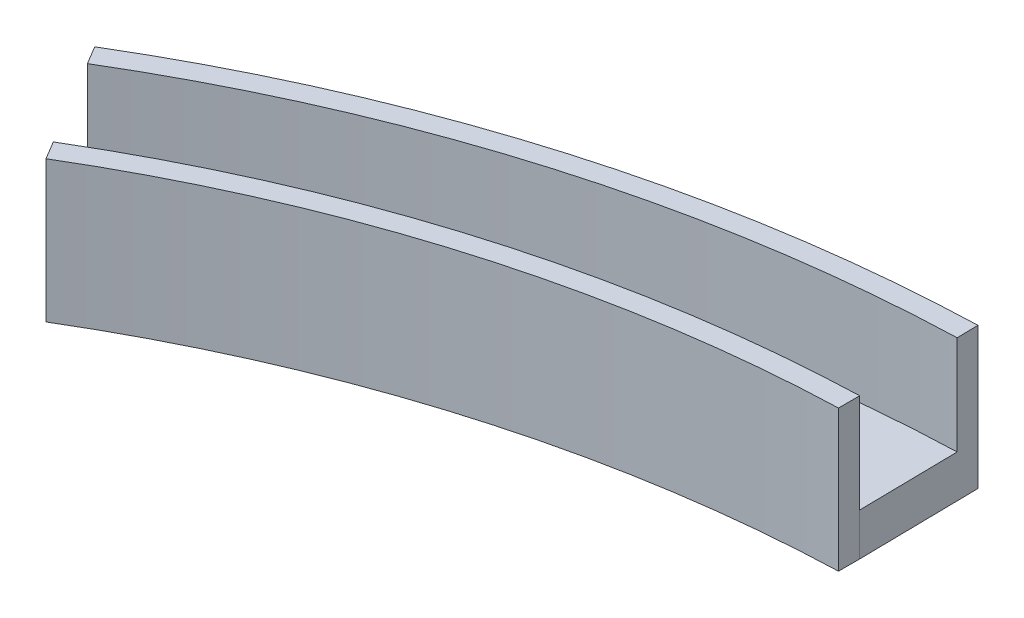
ISO-10303-21;
HEADER;
FILE_DESCRIPTION(('STEP AP214'),'2;1');
FILE_NAME('part.step','',(''),(''),'','','');
FILE_SCHEMA(('AUTOMOTIVE_DESIGN { 1 0 10303 214 1 1 1 1 }'));
ENDSEC;
DATA;
#1=APPLICATION_CONTEXT('core data for automotive mechanical design processes');
#2=APPLICATION_PROTOCOL_DEFINITION('international standard','automotive_design',2000,#1);
#3=PRODUCT_CONTEXT('',#1,'mechanical');
#4=PRODUCT('Part','Part','',(#3));
#5=PRODUCT_RELATED_PRODUCT_CATEGORY('part','',(#4));
#6=PRODUCT_DEFINITION_FORMATION('','',#4);
#7=PRODUCT_DEFINITION_CONTEXT('part definition',#1,'design');
#8=PRODUCT_DEFINITION('design','',#6,#7);
#9=PRODUCT_DEFINITION_SHAPE('','',#8);
#10=(LENGTH_UNIT() NAMED_UNIT(*) SI_UNIT(.MILLI.,.METRE.));
#11=(NAMED_UNIT(*) PLANE_ANGLE_UNIT() SI_UNIT($,.RADIAN.));
#12=(NAMED_UNIT(*) SI_UNIT($,.STERADIAN.) SOLID_ANGLE_UNIT());
#13=UNCERTAINTY_MEASURE_WITH_UNIT(LENGTH_MEASURE(1.E-05),#10,'distance_accuracy_value','');
#14=(GEOMETRIC_REPRESENTATION_CONTEXT(3) GLOBAL_UNCERTAINTY_ASSIGNED_CONTEXT((#13)) GLOBAL_UNIT_ASSIGNED_CONTEXT((#10,
#11,#12)) REPRESENTATION_CONTEXT('',''));
#15=CARTESIAN_POINT('',(0.,0.,0.));
#16=DIRECTION('',(0.,0.,1.));
#17=DIRECTION('',(1.,0.,0.));
#18=AXIS2_PLACEMENT_3D('',#15,#16,#17);
#19=CARTESIAN_POINT('',(0.,10.,0.));
#20=DIRECTION('',(0.,-1.,0.));
#21=DIRECTION('',(0.,0.,-1.));
#22=AXIS2_PLACEMENT_3D('',#19,#20,#21);
#23=PLANE('',#22);
#24=DIRECTION('',(0.,0.,-1.));
#25=VECTOR('',#24,1.);
#26=CARTESIAN_POINT('',(-3.06425353736783,10.,-91.753846651019));
#27=LINE('',#26,#25);
#28=CARTESIAN_POINT('',(-3.06425353736788,10.,-90.2529964890846));
#29=VERTEX_POINT('',#28);
#30=CARTESIAN_POINT('',(-3.06425353736783,10.,-91.7538466510191));
#31=VERTEX_POINT('',#30);
#32=EDGE_CURVE('E175',#29,#31,#27,.T.);
#33=ORIENTED_EDGE('',*,*,#32,.T.);
#34=CARTESIAN_POINT('',(0.,10.,0.));
#35=DIRECTION('',(0.,-1.,0.));
#36=DIRECTION('',(0.,0.,-1.));
#37=AXIS2_PLACEMENT_3D('',#34,#35,#36);
#38=CIRCLE('',#37,91.805);
#39=CARTESIAN_POINT('',(-47.1395277057146,10.,-78.7783152439944));
#40=VERTEX_POINT('',#39);
#41=EDGE_CURVE('E115',#40,#31,#38,.T.);
#42=ORIENTED_EDGE('',*,*,#41,.F.);
#43=DIRECTION('',(0.513474513432979,0.,0.858104844441963));
#44=VECTOR('',#43,1.);
#45=CARTESIAN_POINT('',(-51.5040610698953,10.,-86.0722064217518));
#46=LINE('',#45,#44);
#47=CARTESIAN_POINT('',(-46.3693159355651,10.,-77.4911579773315));
#48=VERTEX_POINT('',#47);
#49=EDGE_CURVE('E166',#40,#48,#46,.T.);
#50=ORIENTED_EDGE('',*,*,#49,.T.);
#51=CARTESIAN_POINT('',(0.,10.,0.));
#52=DIRECTION('',(0.,-1.,0.));
#53=DIRECTION('',(0.,0.,-1.));
#54=AXIS2_PLACEMENT_3D('',#51,#52,#53);
#55=CIRCLE('',#54,90.305);
#56=EDGE_CURVE('E154',#48,#29,#55,.T.);
#57=ORIENTED_EDGE('',*,*,#56,.T.);
#58=EDGE_LOOP('',(#33,#42,#50,#57));
#59=FACE_BOUND('',#58,.T.);
#60=ADVANCED_FACE('F33',(#59),#23,.F.);
#61=CARTESIAN_POINT('',(0.,10.,0.));
#62=DIRECTION('',(0.,-1.,0.));
#63=DIRECTION('',(0.,0.,-1.));
#64=AXIS2_PLACEMENT_3D('',#61,#62,#63);
#65=CYLINDRICAL_SURFACE('',#64,100.305000000001);
#66=CARTESIAN_POINT('',(0.,0.,0.));
#67=DIRECTION('',(0.,1.,0.));
#68=DIRECTION('',(0.,0.,-1.));
#69=AXIS2_PLACEMENT_3D('',#66,#67,#68);
#70=CIRCLE('',#69,100.305000000001);
#71=CARTESIAN_POINT('',(-3.19712388274214,0.,-100.254034451879));
#72=VERTEX_POINT('',#71);
#73=CARTESIAN_POINT('',(-51.5040610698953,0.,-86.0722064217518));
#74=VERTEX_POINT('',#73);
#75=EDGE_CURVE('E162',#72,#74,#70,.T.);
#76=ORIENTED_EDGE('',*,*,#75,.T.);
#77=DIRECTION('',(0.,-1.,0.));
#78=VECTOR('',#77,1.);
#79=CARTESIAN_POINT('',(-51.5040610698953,10.,-86.0722064217518));
#80=LINE('',#79,#78);
#81=CARTESIAN_POINT('',(-51.5040610698953,10.,-86.0722064217518));
#82=VERTEX_POINT('',#81);
#83=EDGE_CURVE('E11',#82,#74,#80,.T.);
#84=ORIENTED_EDGE('',*,*,#83,.F.);
#85=CARTESIAN_POINT('',(0.,10.,0.));
#86=DIRECTION('',(0.,1.,0.));
#87=DIRECTION('',(0.,0.,-1.));
#88=AXIS2_PLACEMENT_3D('',#85,#86,#87);
#89=CIRCLE('',#88,100.305000000001);
#90=CARTESIAN_POINT('',(-3.19712388274214,10.,-100.254034451879));
#91=VERTEX_POINT('',#90);
#92=EDGE_CURVE('E165',#91,#82,#89,.T.);
#93=ORIENTED_EDGE('',*,*,#92,.F.);
#94=DIRECTION('',(0.,-1.,0.));
#95=VECTOR('',#94,1.);
#96=CARTESIAN_POINT('',(-3.19712388274214,10.,-100.254034451879));
#97=LINE('',#96,#95);
#98=EDGE_CURVE('E142',#91,#72,#97,.T.);
#99=ORIENTED_EDGE('',*,*,#98,.T.);
#100=EDGE_LOOP('',(#76,#84,#93,#99));
#101=FACE_BOUND('',#100,.T.);
#102=ADVANCED_FACE('F35',(#101),#65,.T.);
#103=CARTESIAN_POINT('',(-47.1395277057146,10.,-78.7783152439945));
#104=DIRECTION('',(0.858104844441963,0.,-0.513474513432979));
#105=DIRECTION('',(-0.513474513432979,0.,-0.858104844441963));
#106=AXIS2_PLACEMENT_3D('',#103,#104,#105);
#107=PLANE('',#106);
#108=ORIENTED_EDGE('',*,*,#49,.F.);
#109=DIRECTION('',(0.,1.,0.));
#110=VECTOR('',#109,1.);
#111=CARTESIAN_POINT('',(-47.1395277057146,3.,-78.7783152439944));
#112=LINE('',#111,#110);
#113=CARTESIAN_POINT('',(-47.1395277057146,3.,-78.7783152439944));
#114=VERTEX_POINT('',#113);
#115=EDGE_CURVE('E178',#114,#40,#112,.T.);
#116=ORIENTED_EDGE('',*,*,#115,.F.);
#117=DIRECTION('',(0.513474513432979,0.,0.858104844441963));
#118=VECTOR('',#117,1.);
#119=CARTESIAN_POINT('',(-50.7338492997454,3.,-84.7850491550882));
#120=LINE('',#119,#118);
#121=CARTESIAN_POINT('',(-50.7338492997454,3.,-84.7850491550882));
#122=VERTEX_POINT('',#121);
#123=EDGE_CURVE('E130',#122,#114,#120,.T.);
#124=ORIENTED_EDGE('',*,*,#123,.F.);
#125=DIRECTION('',(0.,1.,0.));
#126=VECTOR('',#125,1.);
#127=CARTESIAN_POINT('',(-50.7338492997454,3.,-84.7850491550882));
#128=LINE('',#127,#126);
#129=CARTESIAN_POINT('',(-50.7338492997454,10.,-84.7850491550882));
#130=VERTEX_POINT('',#129);
#131=EDGE_CURVE('E180',#122,#130,#128,.T.);
#132=ORIENTED_EDGE('',*,*,#131,.T.);
#133=EDGE_CURVE('E87',#82,#130,#46,.T.);
#134=ORIENTED_EDGE('',*,*,#133,.F.);
#135=ORIENTED_EDGE('',*,*,#83,.T.);
#136=DIRECTION('',(0.513474513432979,0.,0.858104844441963));
#137=VECTOR('',#136,1.);
#138=CARTESIAN_POINT('',(-47.1395277057146,0.,-78.7783152439945));
#139=LINE('',#138,#137);
#140=CARTESIAN_POINT('',(-46.3693159355651,0.,-77.4911579773315));
#141=VERTEX_POINT('',#140);
#142=EDGE_CURVE('E159',#74,#141,#139,.T.);
#143=ORIENTED_EDGE('',*,*,#142,.T.);
#144=DIRECTION('',(0.,-1.,0.));
#145=VECTOR('',#144,1.);
#146=CARTESIAN_POINT('',(-46.3693159355651,10.,-77.4911579773315));
#147=LINE('',#146,#145);
#148=EDGE_CURVE('E41',#48,#141,#147,.T.);
#149=ORIENTED_EDGE('',*,*,#148,.F.);
#150=EDGE_LOOP('',(#108,#116,#124,#132,#134,#135,#143,#149));
#151=FACE_BOUND('',#150,.T.);
#152=ADVANCED_FACE('F186',(#151),#107,.F.);
#153=CARTESIAN_POINT('',(0.,10.,0.));
#154=DIRECTION('',(0.,-1.,0.));
#155=DIRECTION('',(0.,0.,-1.));
#156=AXIS2_PLACEMENT_3D('',#153,#154,#155);
#157=CYLINDRICAL_SURFACE('',#156,90.305);
#158=CARTESIAN_POINT('',(0.,0.,0.));
#159=DIRECTION('',(0.,-1.,0.));
#160=DIRECTION('',(0.,0.,-1.));
#161=AXIS2_PLACEMENT_3D('',#158,#159,#160);
#162=CIRCLE('',#161,90.305);
#163=CARTESIAN_POINT('',(-3.06425353736788,0.,-90.2529964890846));
#164=VERTEX_POINT('',#163);
#165=EDGE_CURVE('E153',#141,#164,#162,.T.);
#166=ORIENTED_EDGE('',*,*,#165,.T.);
#167=DIRECTION('',(0.,-1.,0.));
#168=VECTOR('',#167,1.);
#169=CARTESIAN_POINT('',(-3.06425353736788,10.,-90.2529964890846));
#170=LINE('',#169,#168);
#171=EDGE_CURVE('E120',#29,#164,#170,.T.);
#172=ORIENTED_EDGE('',*,*,#171,.F.);
#173=ORIENTED_EDGE('',*,*,#56,.F.);
#174=ORIENTED_EDGE('',*,*,#148,.T.);
#175=EDGE_LOOP('',(#166,#172,#173,#174));
#176=FACE_BOUND('',#175,.T.);
#177=ADVANCED_FACE('F151',(#176),#157,.F.);
#178=CARTESIAN_POINT('',(-3.06425353736783,10.,-91.753846651019));
#179=DIRECTION('',(-1.,0.,0.));
#180=DIRECTION('',(0.,0.,1.));
#181=AXIS2_PLACEMENT_3D('',#178,#179,#180);
#182=PLANE('',#181);
#183=DIRECTION('',(0.,0.,-1.));
#184=VECTOR('',#183,1.);
#185=CARTESIAN_POINT('',(-3.06425353736783,0.,-91.753846651019));
#186=LINE('',#185,#184);
#187=CARTESIAN_POINT('',(-3.06425353736783,0.,-91.753846651019));
#188=VERTEX_POINT('',#187);
#189=EDGE_CURVE('E141',#164,#188,#186,.T.);
#190=ORIENTED_EDGE('',*,*,#189,.T.);
#191=DIRECTION('',(0.,-1.,0.));
#192=VECTOR('',#191,1.);
#193=CARTESIAN_POINT('',(-3.06425353736783,10.,-91.753846651019));
#194=LINE('',#193,#192);
#195=CARTESIAN_POINT('',(-3.06425353736783,3.,-91.7538466510191));
#196=VERTEX_POINT('',#195);
#197=EDGE_CURVE('E121',#196,#188,#194,.T.);
#198=ORIENTED_EDGE('',*,*,#197,.F.);
#199=EDGE_CURVE('E109',#31,#196,#194,.T.);
#200=ORIENTED_EDGE('',*,*,#199,.F.);
#201=ORIENTED_EDGE('',*,*,#32,.F.);
#202=ORIENTED_EDGE('',*,*,#171,.T.);
#203=EDGE_LOOP('',(#190,#198,#200,#201,#202));
#204=FACE_BOUND('',#203,.T.);
#205=ADVANCED_FACE('F138',(#204),#182,.F.);
#206=CARTESIAN_POINT('',(-3.19712388274214,10.,-100.254034451879));
#207=DIRECTION('',(-0.999877851113723,0.,0.0156295506078309));
#208=DIRECTION('',(0.0156295506078309,0.,0.999877851113723));
#209=AXIS2_PLACEMENT_3D('',#206,#207,#208);
#210=PLANE('',#209);
#211=DIRECTION('',(-0.0156295506078309,0.,-0.999877851113723));
#212=VECTOR('',#211,1.);
#213=CARTESIAN_POINT('',(-3.19712388274214,10.,-100.254034451879));
#214=LINE('',#213,#212);
#215=CARTESIAN_POINT('',(-3.17367641439483,10.,-98.7540166424471));
#216=VERTEX_POINT('',#215);
#217=EDGE_CURVE('E56',#216,#91,#214,.T.);
#218=ORIENTED_EDGE('',*,*,#217,.F.);
#219=DIRECTION('',(0.,1.,0.));
#220=VECTOR('',#219,1.);
#221=CARTESIAN_POINT('',(-3.17367641439486,3.,-98.7540166424471));
#222=LINE('',#221,#220);
#223=CARTESIAN_POINT('',(-3.17367641439486,3.,-98.7540166424471));
#224=VERTEX_POINT('',#223);
#225=EDGE_CURVE('E48',#224,#216,#222,.T.);
#226=ORIENTED_EDGE('',*,*,#225,.F.);
#227=DIRECTION('',(-0.0156295506078309,0.,-0.999877851113724));
#228=VECTOR('',#227,1.);
#229=CARTESIAN_POINT('',(-3.17367641439484,3.,-98.7540166424471));
#230=LINE('',#229,#228);
#231=EDGE_CURVE('E128',#196,#224,#230,.T.);
#232=ORIENTED_EDGE('',*,*,#231,.F.);
#233=ORIENTED_EDGE('',*,*,#197,.T.);
#234=DIRECTION('',(-0.0156295506078309,0.,-0.999877851113723));
#235=VECTOR('',#234,1.);
#236=CARTESIAN_POINT('',(-3.19712388274214,0.,-100.254034451879));
#237=LINE('',#236,#235);
#238=EDGE_CURVE('E80',#188,#72,#237,.T.);
#239=ORIENTED_EDGE('',*,*,#238,.T.);
#240=ORIENTED_EDGE('',*,*,#98,.F.);
#241=EDGE_LOOP('',(#218,#226,#232,#233,#239,#240));
#242=FACE_BOUND('',#241,.T.);
#243=ADVANCED_FACE('F134',(#242),#210,.F.);
#244=ORIENTED_EDGE('',*,*,#133,.T.);
#245=CARTESIAN_POINT('',(0.,10.,0.));
#246=DIRECTION('',(0.,1.,0.));
#247=DIRECTION('',(0.,0.,-1.));
#248=AXIS2_PLACEMENT_3D('',#245,#246,#247);
#249=CIRCLE('',#248,98.805);
#250=EDGE_CURVE('E132',#216,#130,#249,.T.);
#251=ORIENTED_EDGE('',*,*,#250,.F.);
#252=ORIENTED_EDGE('',*,*,#217,.T.);
#253=ORIENTED_EDGE('',*,*,#92,.T.);
#254=EDGE_LOOP('',(#244,#251,#252,#253));
#255=FACE_BOUND('',#254,.T.);
#256=ADVANCED_FACE('F190',(#255),#23,.F.);
#257=CARTESIAN_POINT('',(0.,0.,0.));
#258=DIRECTION('',(0.,-1.,0.));
#259=DIRECTION('',(0.,0.,-1.));
#260=AXIS2_PLACEMENT_3D('',#257,#258,#259);
#261=PLANE('',#260);
#262=ORIENTED_EDGE('',*,*,#75,.F.);
#263=ORIENTED_EDGE('',*,*,#238,.F.);
#264=ORIENTED_EDGE('',*,*,#189,.F.);
#265=ORIENTED_EDGE('',*,*,#165,.F.);
#266=ORIENTED_EDGE('',*,*,#142,.F.);
#267=EDGE_LOOP('',(#262,#263,#264,#265,#266));
#268=FACE_BOUND('',#267,.T.);
#269=ADVANCED_FACE('F158',(#268),#261,.T.);
#270=CARTESIAN_POINT('',(0.,3.,0.));
#271=DIRECTION('',(0.,1.,0.));
#272=DIRECTION('',(0.,0.,1.));
#273=AXIS2_PLACEMENT_3D('',#270,#271,#272);
#274=CYLINDRICAL_SURFACE('',#273,91.805);
#275=ORIENTED_EDGE('',*,*,#41,.T.);
#276=ORIENTED_EDGE('',*,*,#199,.T.);
#277=CARTESIAN_POINT('',(0.,3.,0.));
#278=DIRECTION('',(0.,-1.,0.));
#279=DIRECTION('',(0.,0.,-1.));
#280=AXIS2_PLACEMENT_3D('',#277,#278,#279);
#281=CIRCLE('',#280,91.805);
#282=EDGE_CURVE('E112',#114,#196,#281,.T.);
#283=ORIENTED_EDGE('',*,*,#282,.F.);
#284=ORIENTED_EDGE('',*,*,#115,.T.);
#285=EDGE_LOOP('',(#275,#276,#283,#284));
#286=FACE_BOUND('',#285,.T.);
#287=ADVANCED_FACE('F111',(#286),#274,.T.);
#288=CARTESIAN_POINT('',(0.,3.,0.));
#289=DIRECTION('',(0.,1.,0.));
#290=DIRECTION('',(0.,0.,1.));
#291=AXIS2_PLACEMENT_3D('',#288,#289,#290);
#292=CYLINDRICAL_SURFACE('',#291,98.805);
#293=ORIENTED_EDGE('',*,*,#250,.T.);
#294=ORIENTED_EDGE('',*,*,#131,.F.);
#295=CARTESIAN_POINT('',(0.,3.,0.));
#296=DIRECTION('',(0.,1.,0.));
#297=DIRECTION('',(0.,0.,-1.));
#298=AXIS2_PLACEMENT_3D('',#295,#296,#297);
#299=CIRCLE('',#298,98.805);
#300=EDGE_CURVE('E136',#224,#122,#299,.T.);
#301=ORIENTED_EDGE('',*,*,#300,.F.);
#302=ORIENTED_EDGE('',*,*,#225,.T.);
#303=EDGE_LOOP('',(#293,#294,#301,#302));
#304=FACE_BOUND('',#303,.T.);
#305=ADVANCED_FACE('F202',(#304),#292,.F.);
#306=CARTESIAN_POINT('',(0.,3.,0.));
#307=DIRECTION('',(0.,-1.,0.));
#308=DIRECTION('',(0.,0.,-1.));
#309=AXIS2_PLACEMENT_3D('',#306,#307,#308);
#310=PLANE('',#309);
#311=ORIENTED_EDGE('',*,*,#282,.T.);
#312=ORIENTED_EDGE('',*,*,#231,.T.);
#313=ORIENTED_EDGE('',*,*,#300,.T.);
#314=ORIENTED_EDGE('',*,*,#123,.T.);
#315=EDGE_LOOP('',(#311,#312,#313,#314));
#316=FACE_BOUND('',#315,.T.);
#317=ADVANCED_FACE('F126',(#316),#310,.F.);
#318=CLOSED_SHELL('',(#60,#102,#152,#177,#205,#243,#256,#269,#287,#305,#317));
#319=MANIFOLD_SOLID_BREP('B2',#318);
#320=ADVANCED_BREP_SHAPE_REPRESENTATION('',(#18,#319),#14);
#321=SHAPE_DEFINITION_REPRESENTATION(#9,#320);
ENDSEC;
END-ISO-10303-21;
